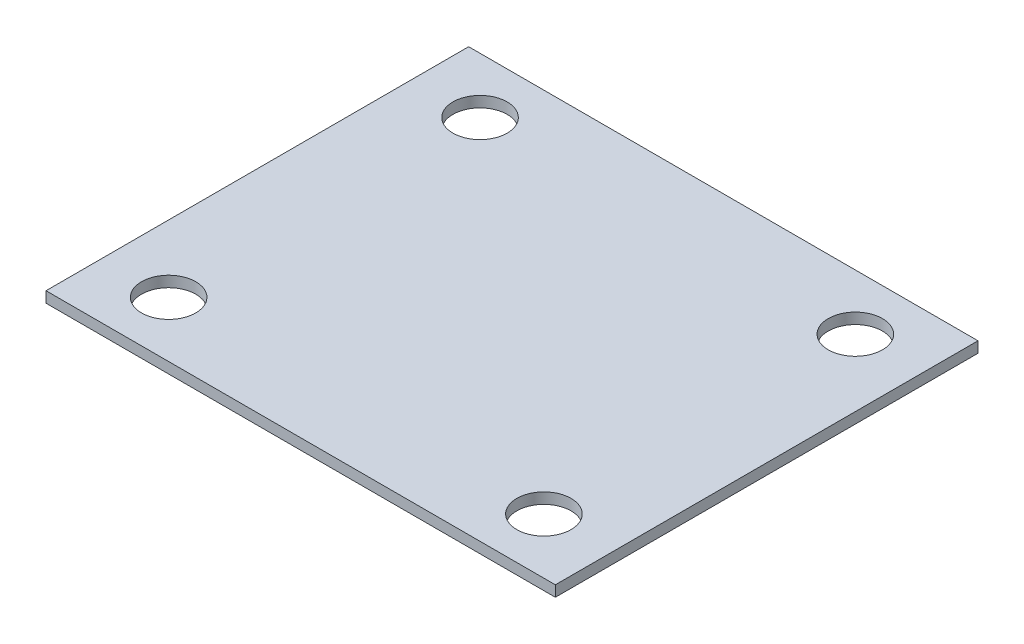
ISO-10303-21;
HEADER;
FILE_DESCRIPTION(('STEP AP214'),'2;1');
FILE_NAME('part.step','',(''),(''),'','','');
FILE_SCHEMA(('AUTOMOTIVE_DESIGN { 1 0 10303 214 1 1 1 1 }'));
ENDSEC;
DATA;
#1=APPLICATION_CONTEXT('core data for automotive mechanical design processes');
#2=APPLICATION_PROTOCOL_DEFINITION('international standard','automotive_design',2000,#1);
#3=PRODUCT_CONTEXT('',#1,'mechanical');
#4=PRODUCT('Part','Part','',(#3));
#5=PRODUCT_RELATED_PRODUCT_CATEGORY('part','',(#4));
#6=PRODUCT_DEFINITION_FORMATION('','',#4);
#7=PRODUCT_DEFINITION_CONTEXT('part definition',#1,'design');
#8=PRODUCT_DEFINITION('design','',#6,#7);
#9=PRODUCT_DEFINITION_SHAPE('','',#8);
#10=(LENGTH_UNIT() NAMED_UNIT(*) SI_UNIT(.MILLI.,.METRE.));
#11=(NAMED_UNIT(*) PLANE_ANGLE_UNIT() SI_UNIT($,.RADIAN.));
#12=(NAMED_UNIT(*) SI_UNIT($,.STERADIAN.) SOLID_ANGLE_UNIT());
#13=UNCERTAINTY_MEASURE_WITH_UNIT(LENGTH_MEASURE(1.E-05),#10,'distance_accuracy_value','');
#14=(GEOMETRIC_REPRESENTATION_CONTEXT(3) GLOBAL_UNCERTAINTY_ASSIGNED_CONTEXT((#13)) GLOBAL_UNIT_ASSIGNED_CONTEXT((#10,
#11,#12)) REPRESENTATION_CONTEXT('',''));
#15=CARTESIAN_POINT('',(0.,0.,0.));
#16=DIRECTION('',(0.,0.,1.));
#17=DIRECTION('',(1.,0.,0.));
#18=AXIS2_PLACEMENT_3D('',#15,#16,#17);
#19=CARTESIAN_POINT('',(-23.5,1.,-19.5));
#20=DIRECTION('',(1.,0.,0.));
#21=DIRECTION('',(0.,0.,-1.));
#22=AXIS2_PLACEMENT_3D('',#19,#20,#21);
#23=PLANE('',#22);
#24=DIRECTION('',(0.,0.,1.));
#25=VECTOR('',#24,1.);
#26=CARTESIAN_POINT('',(-23.5,0.,-19.5));
#27=LINE('',#26,#25);
#28=CARTESIAN_POINT('',(-23.5,0.,-19.5));
#29=VERTEX_POINT('',#28);
#30=CARTESIAN_POINT('',(-23.5,0.,19.5));
#31=VERTEX_POINT('',#30);
#32=EDGE_CURVE('E98',#29,#31,#27,.T.);
#33=ORIENTED_EDGE('',*,*,#32,.T.);
#34=DIRECTION('',(0.,-1.,0.));
#35=VECTOR('',#34,1.);
#36=CARTESIAN_POINT('',(-23.5,1.,19.5));
#37=LINE('',#36,#35);
#38=CARTESIAN_POINT('',(-23.5,1.,19.5));
#39=VERTEX_POINT('',#38);
#40=EDGE_CURVE('E11',#39,#31,#37,.T.);
#41=ORIENTED_EDGE('',*,*,#40,.F.);
#42=DIRECTION('',(0.,0.,1.));
#43=VECTOR('',#42,1.);
#44=CARTESIAN_POINT('',(-23.5,1.,-19.5));
#45=LINE('',#44,#43);
#46=CARTESIAN_POINT('',(-23.5,1.,-19.5));
#47=VERTEX_POINT('',#46);
#48=EDGE_CURVE('E84',#47,#39,#45,.T.);
#49=ORIENTED_EDGE('',*,*,#48,.F.);
#50=DIRECTION('',(0.,-1.,0.));
#51=VECTOR('',#50,1.);
#52=CARTESIAN_POINT('',(-23.5,1.,-19.5));
#53=LINE('',#52,#51);
#54=EDGE_CURVE('E51',#47,#29,#53,.T.);
#55=ORIENTED_EDGE('',*,*,#54,.T.);
#56=EDGE_LOOP('',(#33,#41,#49,#55));
#57=FACE_BOUND('',#56,.T.);
#58=ADVANCED_FACE('F35',(#57),#23,.F.);
#59=CARTESIAN_POINT('',(-23.5,1.,19.5));
#60=DIRECTION('',(0.,0.,-1.));
#61=DIRECTION('',(-1.,0.,0.));
#62=AXIS2_PLACEMENT_3D('',#59,#60,#61);
#63=PLANE('',#62);
#64=DIRECTION('',(1.,0.,0.));
#65=VECTOR('',#64,1.);
#66=CARTESIAN_POINT('',(-23.5,0.,19.5));
#67=LINE('',#66,#65);
#68=CARTESIAN_POINT('',(23.5,0.,19.5));
#69=VERTEX_POINT('',#68);
#70=EDGE_CURVE('E89',#31,#69,#67,.T.);
#71=ORIENTED_EDGE('',*,*,#70,.T.);
#72=DIRECTION('',(0.,-1.,0.));
#73=VECTOR('',#72,1.);
#74=CARTESIAN_POINT('',(23.5,1.,19.5));
#75=LINE('',#74,#73);
#76=CARTESIAN_POINT('',(23.5,1.,19.5));
#77=VERTEX_POINT('',#76);
#78=EDGE_CURVE('E43',#77,#69,#75,.T.);
#79=ORIENTED_EDGE('',*,*,#78,.F.);
#80=DIRECTION('',(1.,0.,0.));
#81=VECTOR('',#80,1.);
#82=CARTESIAN_POINT('',(-23.5,1.,19.5));
#83=LINE('',#82,#81);
#84=EDGE_CURVE('E76',#39,#77,#83,.T.);
#85=ORIENTED_EDGE('',*,*,#84,.F.);
#86=ORIENTED_EDGE('',*,*,#40,.T.);
#87=EDGE_LOOP('',(#71,#79,#85,#86));
#88=FACE_BOUND('',#87,.T.);
#89=ADVANCED_FACE('F88',(#88),#63,.F.);
#90=CARTESIAN_POINT('',(23.5,1.,-19.5));
#91=DIRECTION('',(1.,0.,0.));
#92=DIRECTION('',(0.,0.,-1.));
#93=AXIS2_PLACEMENT_3D('',#90,#91,#92);
#94=PLANE('',#93);
#95=DIRECTION('',(0.,0.,1.));
#96=VECTOR('',#95,1.);
#97=CARTESIAN_POINT('',(23.5,0.,-19.5));
#98=LINE('',#97,#96);
#99=CARTESIAN_POINT('',(23.5,0.,-19.5));
#100=VERTEX_POINT('',#99);
#101=EDGE_CURVE('E102',#100,#69,#98,.T.);
#102=ORIENTED_EDGE('',*,*,#101,.F.);
#103=DIRECTION('',(0.,-1.,0.));
#104=VECTOR('',#103,1.);
#105=CARTESIAN_POINT('',(23.5,1.,-19.5));
#106=LINE('',#105,#104);
#107=CARTESIAN_POINT('',(23.5,1.,-19.5));
#108=VERTEX_POINT('',#107);
#109=EDGE_CURVE('E65',#108,#100,#106,.T.);
#110=ORIENTED_EDGE('',*,*,#109,.F.);
#111=DIRECTION('',(0.,0.,1.));
#112=VECTOR('',#111,1.);
#113=CARTESIAN_POINT('',(23.5,1.,-19.5));
#114=LINE('',#113,#112);
#115=EDGE_CURVE('E83',#108,#77,#114,.T.);
#116=ORIENTED_EDGE('',*,*,#115,.T.);
#117=ORIENTED_EDGE('',*,*,#78,.T.);
#118=EDGE_LOOP('',(#102,#110,#116,#117));
#119=FACE_BOUND('',#118,.T.);
#120=ADVANCED_FACE('F92',(#119),#94,.T.);
#121=CARTESIAN_POINT('',(-23.5,1.,-19.5));
#122=DIRECTION('',(0.,0.,-1.));
#123=DIRECTION('',(-1.,0.,0.));
#124=AXIS2_PLACEMENT_3D('',#121,#122,#123);
#125=PLANE('',#124);
#126=DIRECTION('',(1.,0.,0.));
#127=VECTOR('',#126,1.);
#128=CARTESIAN_POINT('',(-23.5,0.,-19.5));
#129=LINE('',#128,#127);
#130=EDGE_CURVE('E104',#29,#100,#129,.T.);
#131=ORIENTED_EDGE('',*,*,#130,.F.);
#132=ORIENTED_EDGE('',*,*,#54,.F.);
#133=DIRECTION('',(1.,0.,0.));
#134=VECTOR('',#133,1.);
#135=CARTESIAN_POINT('',(-23.5,1.,-19.5));
#136=LINE('',#135,#134);
#137=EDGE_CURVE('E93',#47,#108,#136,.T.);
#138=ORIENTED_EDGE('',*,*,#137,.T.);
#139=ORIENTED_EDGE('',*,*,#109,.T.);
#140=EDGE_LOOP('',(#131,#132,#138,#139));
#141=FACE_BOUND('',#140,.T.);
#142=ADVANCED_FACE('F147',(#141),#125,.T.);
#143=CARTESIAN_POINT('',(0.,1.,0.));
#144=DIRECTION('',(0.,1.,0.));
#145=DIRECTION('',(0.,0.,1.));
#146=AXIS2_PLACEMENT_3D('',#143,#144,#145);
#147=PLANE('',#146);
#148=CARTESIAN_POINT('',(-17.3151381179272,1.,-14.3678805659396));
#149=DIRECTION('',(0.,1.,0.));
#150=DIRECTION('',(0.,0.,1.));
#151=AXIS2_PLACEMENT_3D('',#148,#149,#150);
#152=CIRCLE('',#151,2.5);
#153=CARTESIAN_POINT('',(-17.3151381179272,1.,-11.8678805659396));
#154=VERTEX_POINT('',#153);
#155=EDGE_CURVE('E123',#154,#154,#152,.T.);
#156=ORIENTED_EDGE('',*,*,#155,.F.);
#157=EDGE_LOOP('',(#156));
#158=FACE_BOUND('',#157,.T.);
#159=CARTESIAN_POINT('',(17.3151381179272,1.,14.3678805659396));
#160=DIRECTION('',(0.,1.,0.));
#161=DIRECTION('',(0.,0.,1.));
#162=AXIS2_PLACEMENT_3D('',#159,#160,#161);
#163=CIRCLE('',#162,2.5);
#164=CARTESIAN_POINT('',(17.3151381179272,1.,16.8678805659396));
#165=VERTEX_POINT('',#164);
#166=EDGE_CURVE('E116',#165,#165,#163,.T.);
#167=ORIENTED_EDGE('',*,*,#166,.F.);
#168=EDGE_LOOP('',(#167));
#169=FACE_BOUND('',#168,.T.);
#170=CARTESIAN_POINT('',(-17.3151381179272,1.,14.3678805659396));
#171=DIRECTION('',(0.,1.,0.));
#172=DIRECTION('',(0.,0.,1.));
#173=AXIS2_PLACEMENT_3D('',#170,#171,#172);
#174=CIRCLE('',#173,2.5);
#175=CARTESIAN_POINT('',(-17.3151381179272,1.,16.8678805659396));
#176=VERTEX_POINT('',#175);
#177=EDGE_CURVE('E128',#176,#176,#174,.T.);
#178=ORIENTED_EDGE('',*,*,#177,.F.);
#179=EDGE_LOOP('',(#178));
#180=FACE_BOUND('',#179,.T.);
#181=CARTESIAN_POINT('',(17.3151381179272,1.,-14.3678805659396));
#182=DIRECTION('',(0.,1.,0.));
#183=DIRECTION('',(0.,0.,1.));
#184=AXIS2_PLACEMENT_3D('',#181,#182,#183);
#185=CIRCLE('',#184,2.5);
#186=CARTESIAN_POINT('',(17.3151381179272,1.,-11.8678805659396));
#187=VERTEX_POINT('',#186);
#188=EDGE_CURVE('E110',#187,#187,#185,.T.);
#189=ORIENTED_EDGE('',*,*,#188,.F.);
#190=EDGE_LOOP('',(#189));
#191=FACE_BOUND('',#190,.T.);
#192=ORIENTED_EDGE('',*,*,#48,.T.);
#193=ORIENTED_EDGE('',*,*,#84,.T.);
#194=ORIENTED_EDGE('',*,*,#115,.F.);
#195=ORIENTED_EDGE('',*,*,#137,.F.);
#196=EDGE_LOOP('',(#192,#193,#194,#195));
#197=FACE_BOUND('',#196,.T.);
#198=ADVANCED_FACE('F80',(#158,#169,#180,#191,#197),#147,.T.);
#199=CARTESIAN_POINT('',(0.,0.,0.));
#200=DIRECTION('',(0.,1.,0.));
#201=DIRECTION('',(0.,0.,1.));
#202=AXIS2_PLACEMENT_3D('',#199,#200,#201);
#203=PLANE('',#202);
#204=CARTESIAN_POINT('',(-17.3151381179272,0.,-14.3678805659396));
#205=DIRECTION('',(0.,1.,0.));
#206=DIRECTION('',(0.,0.,1.));
#207=AXIS2_PLACEMENT_3D('',#204,#205,#206);
#208=CIRCLE('',#207,2.5);
#209=CARTESIAN_POINT('',(-17.3151381179272,0.,-11.8678805659396));
#210=VERTEX_POINT('',#209);
#211=EDGE_CURVE('E113',#210,#210,#208,.T.);
#212=ORIENTED_EDGE('',*,*,#211,.T.);
#213=EDGE_LOOP('',(#212));
#214=FACE_BOUND('',#213,.T.);
#215=CARTESIAN_POINT('',(17.3151381179272,0.,14.3678805659396));
#216=DIRECTION('',(0.,1.,0.));
#217=DIRECTION('',(0.,0.,1.));
#218=AXIS2_PLACEMENT_3D('',#215,#216,#217);
#219=CIRCLE('',#218,2.5);
#220=CARTESIAN_POINT('',(17.3151381179272,0.,16.8678805659396));
#221=VERTEX_POINT('',#220);
#222=EDGE_CURVE('E119',#221,#221,#219,.T.);
#223=ORIENTED_EDGE('',*,*,#222,.T.);
#224=EDGE_LOOP('',(#223));
#225=FACE_BOUND('',#224,.T.);
#226=CARTESIAN_POINT('',(-17.3151381179272,0.,14.3678805659396));
#227=DIRECTION('',(0.,1.,0.));
#228=DIRECTION('',(0.,0.,1.));
#229=AXIS2_PLACEMENT_3D('',#226,#227,#228);
#230=CIRCLE('',#229,2.5);
#231=CARTESIAN_POINT('',(-17.3151381179272,0.,16.8678805659396));
#232=VERTEX_POINT('',#231);
#233=EDGE_CURVE('E120',#232,#232,#230,.T.);
#234=ORIENTED_EDGE('',*,*,#233,.T.);
#235=EDGE_LOOP('',(#234));
#236=FACE_BOUND('',#235,.T.);
#237=CARTESIAN_POINT('',(17.3151381179272,0.,-14.3678805659396));
#238=DIRECTION('',(0.,1.,0.));
#239=DIRECTION('',(0.,0.,1.));
#240=AXIS2_PLACEMENT_3D('',#237,#238,#239);
#241=CIRCLE('',#240,2.5);
#242=CARTESIAN_POINT('',(17.3151381179272,0.,-11.8678805659396));
#243=VERTEX_POINT('',#242);
#244=EDGE_CURVE('E100',#243,#243,#241,.T.);
#245=ORIENTED_EDGE('',*,*,#244,.T.);
#246=EDGE_LOOP('',(#245));
#247=FACE_BOUND('',#246,.T.);
#248=ORIENTED_EDGE('',*,*,#32,.F.);
#249=ORIENTED_EDGE('',*,*,#130,.T.);
#250=ORIENTED_EDGE('',*,*,#101,.T.);
#251=ORIENTED_EDGE('',*,*,#70,.F.);
#252=EDGE_LOOP('',(#248,#249,#250,#251));
#253=FACE_BOUND('',#252,.T.);
#254=ADVANCED_FACE('F134',(#214,#225,#236,#247,#253),#203,.F.);
#255=CARTESIAN_POINT('',(17.3151381179272,0.,-14.3678805659396));
#256=DIRECTION('',(0.,1.,0.));
#257=DIRECTION('',(0.,0.,1.));
#258=AXIS2_PLACEMENT_3D('',#255,#256,#257);
#259=CYLINDRICAL_SURFACE('',#258,2.5);
#260=ORIENTED_EDGE('',*,*,#244,.F.);
#261=EDGE_LOOP('',(#260));
#262=FACE_BOUND('',#261,.T.);
#263=ORIENTED_EDGE('',*,*,#188,.T.);
#264=EDGE_LOOP('',(#263));
#265=FACE_BOUND('',#264,.T.);
#266=ADVANCED_FACE('F141',(#262,#265),#259,.F.);
#267=CARTESIAN_POINT('',(-17.3151381179272,0.,14.3678805659396));
#268=DIRECTION('',(0.,1.,0.));
#269=DIRECTION('',(0.,0.,1.));
#270=AXIS2_PLACEMENT_3D('',#267,#268,#269);
#271=CYLINDRICAL_SURFACE('',#270,2.5);
#272=ORIENTED_EDGE('',*,*,#233,.F.);
#273=EDGE_LOOP('',(#272));
#274=FACE_BOUND('',#273,.T.);
#275=ORIENTED_EDGE('',*,*,#177,.T.);
#276=EDGE_LOOP('',(#275));
#277=FACE_BOUND('',#276,.T.);
#278=ADVANCED_FACE('F137',(#274,#277),#271,.F.);
#279=CARTESIAN_POINT('',(17.3151381179272,0.,14.3678805659396));
#280=DIRECTION('',(0.,1.,0.));
#281=DIRECTION('',(0.,0.,1.));
#282=AXIS2_PLACEMENT_3D('',#279,#280,#281);
#283=CYLINDRICAL_SURFACE('',#282,2.5);
#284=ORIENTED_EDGE('',*,*,#222,.F.);
#285=EDGE_LOOP('',(#284));
#286=FACE_BOUND('',#285,.T.);
#287=ORIENTED_EDGE('',*,*,#166,.T.);
#288=EDGE_LOOP('',(#287));
#289=FACE_BOUND('',#288,.T.);
#290=ADVANCED_FACE('F140',(#286,#289),#283,.F.);
#291=CARTESIAN_POINT('',(-17.3151381179272,0.,-14.3678805659396));
#292=DIRECTION('',(0.,1.,0.));
#293=DIRECTION('',(0.,0.,1.));
#294=AXIS2_PLACEMENT_3D('',#291,#292,#293);
#295=CYLINDRICAL_SURFACE('',#294,2.5);
#296=ORIENTED_EDGE('',*,*,#211,.F.);
#297=EDGE_LOOP('',(#296));
#298=FACE_BOUND('',#297,.T.);
#299=ORIENTED_EDGE('',*,*,#155,.T.);
#300=EDGE_LOOP('',(#299));
#301=FACE_BOUND('',#300,.T.);
#302=ADVANCED_FACE('F219',(#298,#301),#295,.F.);
#303=CLOSED_SHELL('',(#58,#89,#120,#142,#198,#254,#266,#278,#290,#302));
#304=MANIFOLD_SOLID_BREP('B2',#303);
#305=ADVANCED_BREP_SHAPE_REPRESENTATION('',(#18,#304),#14);
#306=SHAPE_DEFINITION_REPRESENTATION(#9,#305);
ENDSEC;
END-ISO-10303-21;
